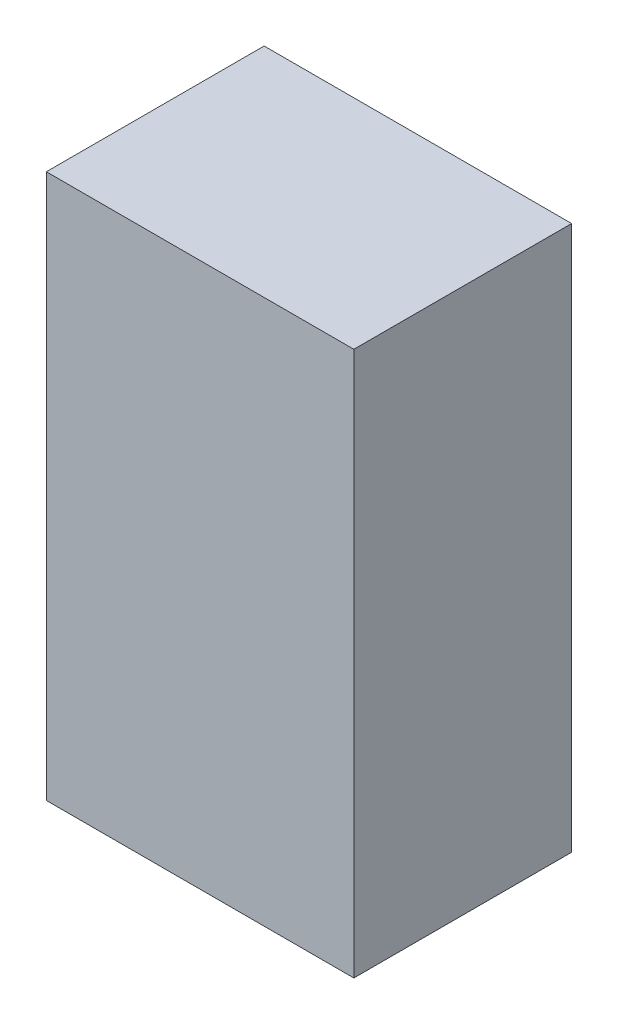
ISO-10303-21;
HEADER;
FILE_DESCRIPTION(('STEP AP214'),'2;1');
FILE_NAME('part.step','',(''),(''),'','','');
FILE_SCHEMA(('AUTOMOTIVE_DESIGN { 1 0 10303 214 1 1 1 1 }'));
ENDSEC;
DATA;
#1=APPLICATION_CONTEXT('core data for automotive mechanical design processes');
#2=APPLICATION_PROTOCOL_DEFINITION('international standard','automotive_design',2000,#1);
#3=PRODUCT_CONTEXT('',#1,'mechanical');
#4=PRODUCT('Part','Part','',(#3));
#5=PRODUCT_RELATED_PRODUCT_CATEGORY('part','',(#4));
#6=PRODUCT_DEFINITION_FORMATION('','',#4);
#7=PRODUCT_DEFINITION_CONTEXT('part definition',#1,'design');
#8=PRODUCT_DEFINITION('design','',#6,#7);
#9=PRODUCT_DEFINITION_SHAPE('','',#8);
#10=(LENGTH_UNIT() NAMED_UNIT(*) SI_UNIT(.MILLI.,.METRE.));
#11=(NAMED_UNIT(*) PLANE_ANGLE_UNIT() SI_UNIT($,.RADIAN.));
#12=(NAMED_UNIT(*) SI_UNIT($,.STERADIAN.) SOLID_ANGLE_UNIT());
#13=UNCERTAINTY_MEASURE_WITH_UNIT(LENGTH_MEASURE(1.E-05),#10,'distance_accuracy_value','');
#14=(GEOMETRIC_REPRESENTATION_CONTEXT(3) GLOBAL_UNCERTAINTY_ASSIGNED_CONTEXT((#13)) GLOBAL_UNIT_ASSIGNED_CONTEXT((#10,
#11,#12)) REPRESENTATION_CONTEXT('',''));
#15=CARTESIAN_POINT('',(0.,0.,0.));
#16=DIRECTION('',(0.,0.,1.));
#17=DIRECTION('',(1.,0.,0.));
#18=AXIS2_PLACEMENT_3D('',#15,#16,#17);
#19=CARTESIAN_POINT('',(0.,0.,34.));
#20=DIRECTION('',(1.,0.,0.));
#21=DIRECTION('',(0.,1.,0.));
#22=AXIS2_PLACEMENT_3D('',#19,#20,#21);
#23=PLANE('',#22);
#24=DIRECTION('',(0.,-1.,0.));
#25=VECTOR('',#24,1.);
#26=CARTESIAN_POINT('',(0.,0.,0.));
#27=LINE('',#26,#25);
#28=CARTESIAN_POINT('',(0.,0.,0.));
#29=VERTEX_POINT('',#28);
#30=CARTESIAN_POINT('',(0.,-85.,0.));
#31=VERTEX_POINT('',#30);
#32=EDGE_CURVE('E100',#29,#31,#27,.T.);
#33=ORIENTED_EDGE('',*,*,#32,.T.);
#34=DIRECTION('',(0.,0.,-1.));
#35=VECTOR('',#34,1.);
#36=CARTESIAN_POINT('',(0.,-85.,34.));
#37=LINE('',#36,#35);
#38=CARTESIAN_POINT('',(0.,-85.,34.));
#39=VERTEX_POINT('',#38);
#40=EDGE_CURVE('E11',#39,#31,#37,.T.);
#41=ORIENTED_EDGE('',*,*,#40,.F.);
#42=DIRECTION('',(0.,-1.,0.));
#43=VECTOR('',#42,1.);
#44=CARTESIAN_POINT('',(0.,0.,34.));
#45=LINE('',#44,#43);
#46=CARTESIAN_POINT('',(0.,0.,34.));
#47=VERTEX_POINT('',#46);
#48=EDGE_CURVE('E88',#47,#39,#45,.T.);
#49=ORIENTED_EDGE('',*,*,#48,.F.);
#50=DIRECTION('',(0.,0.,-1.));
#51=VECTOR('',#50,1.);
#52=CARTESIAN_POINT('',(0.,0.,34.));
#53=LINE('',#52,#51);
#54=EDGE_CURVE('E96',#47,#29,#53,.T.);
#55=ORIENTED_EDGE('',*,*,#54,.T.);
#56=EDGE_LOOP('',(#33,#41,#49,#55));
#57=FACE_BOUND('',#56,.T.);
#58=ADVANCED_FACE('F37',(#57),#23,.F.);
#59=CARTESIAN_POINT('',(0.,-85.,34.));
#60=DIRECTION('',(0.,1.,0.));
#61=DIRECTION('',(0.,0.,1.));
#62=AXIS2_PLACEMENT_3D('',#59,#60,#61);
#63=PLANE('',#62);
#64=DIRECTION('',(1.,0.,0.));
#65=VECTOR('',#64,1.);
#66=CARTESIAN_POINT('',(0.,-85.,0.));
#67=LINE('',#66,#65);
#68=CARTESIAN_POINT('',(48.,-85.,0.));
#69=VERTEX_POINT('',#68);
#70=EDGE_CURVE('E92',#31,#69,#67,.T.);
#71=ORIENTED_EDGE('',*,*,#70,.T.);
#72=DIRECTION('',(0.,0.,-1.));
#73=VECTOR('',#72,1.);
#74=CARTESIAN_POINT('',(48.,-85.,34.));
#75=LINE('',#74,#73);
#76=CARTESIAN_POINT('',(48.,-85.,34.));
#77=VERTEX_POINT('',#76);
#78=EDGE_CURVE('E45',#77,#69,#75,.T.);
#79=ORIENTED_EDGE('',*,*,#78,.F.);
#80=DIRECTION('',(1.,0.,0.));
#81=VECTOR('',#80,1.);
#82=CARTESIAN_POINT('',(0.,-85.,34.));
#83=LINE('',#82,#81);
#84=EDGE_CURVE('E83',#39,#77,#83,.T.);
#85=ORIENTED_EDGE('',*,*,#84,.F.);
#86=ORIENTED_EDGE('',*,*,#40,.T.);
#87=EDGE_LOOP('',(#71,#79,#85,#86));
#88=FACE_BOUND('',#87,.T.);
#89=ADVANCED_FACE('F91',(#88),#63,.F.);
#90=CARTESIAN_POINT('',(48.,0.,34.));
#91=DIRECTION('',(-1.,0.,0.));
#92=DIRECTION('',(0.,-1.,0.));
#93=AXIS2_PLACEMENT_3D('',#90,#91,#92);
#94=PLANE('',#93);
#95=DIRECTION('',(0.,1.,0.));
#96=VECTOR('',#95,1.);
#97=CARTESIAN_POINT('',(48.,0.,0.));
#98=LINE('',#97,#96);
#99=CARTESIAN_POINT('',(48.,0.,0.));
#100=VERTEX_POINT('',#99);
#101=EDGE_CURVE('E70',#69,#100,#98,.T.);
#102=ORIENTED_EDGE('',*,*,#101,.T.);
#103=DIRECTION('',(0.,0.,-1.));
#104=VECTOR('',#103,1.);
#105=CARTESIAN_POINT('',(48.,0.,34.));
#106=LINE('',#105,#104);
#107=CARTESIAN_POINT('',(48.,0.,34.));
#108=VERTEX_POINT('',#107);
#109=EDGE_CURVE('E93',#108,#100,#106,.T.);
#110=ORIENTED_EDGE('',*,*,#109,.F.);
#111=DIRECTION('',(0.,1.,0.));
#112=VECTOR('',#111,1.);
#113=CARTESIAN_POINT('',(48.,0.,34.));
#114=LINE('',#113,#112);
#115=EDGE_CURVE('E86',#77,#108,#114,.T.);
#116=ORIENTED_EDGE('',*,*,#115,.F.);
#117=ORIENTED_EDGE('',*,*,#78,.T.);
#118=EDGE_LOOP('',(#102,#110,#116,#117));
#119=FACE_BOUND('',#118,.T.);
#120=ADVANCED_FACE('F94',(#119),#94,.F.);
#121=CARTESIAN_POINT('',(0.,0.,34.));
#122=DIRECTION('',(0.,-1.,0.));
#123=DIRECTION('',(0.,0.,-1.));
#124=AXIS2_PLACEMENT_3D('',#121,#122,#123);
#125=PLANE('',#124);
#126=DIRECTION('',(-1.,0.,0.));
#127=VECTOR('',#126,1.);
#128=CARTESIAN_POINT('',(0.,0.,0.));
#129=LINE('',#128,#127);
#130=EDGE_CURVE('E76',#100,#29,#129,.T.);
#131=ORIENTED_EDGE('',*,*,#130,.T.);
#132=ORIENTED_EDGE('',*,*,#54,.F.);
#133=DIRECTION('',(-1.,0.,0.));
#134=VECTOR('',#133,1.);
#135=CARTESIAN_POINT('',(0.,0.,34.));
#136=LINE('',#135,#134);
#137=EDGE_CURVE('E53',#108,#47,#136,.T.);
#138=ORIENTED_EDGE('',*,*,#137,.F.);
#139=ORIENTED_EDGE('',*,*,#109,.T.);
#140=EDGE_LOOP('',(#131,#132,#138,#139));
#141=FACE_BOUND('',#140,.T.);
#142=ADVANCED_FACE('F107',(#141),#125,.F.);
#143=CARTESIAN_POINT('',(0.,0.,34.));
#144=DIRECTION('',(0.,0.,1.));
#145=DIRECTION('',(1.,0.,0.));
#146=AXIS2_PLACEMENT_3D('',#143,#144,#145);
#147=PLANE('',#146);
#148=ORIENTED_EDGE('',*,*,#48,.T.);
#149=ORIENTED_EDGE('',*,*,#84,.T.);
#150=ORIENTED_EDGE('',*,*,#115,.T.);
#151=ORIENTED_EDGE('',*,*,#137,.T.);
#152=EDGE_LOOP('',(#148,#149,#150,#151));
#153=FACE_BOUND('',#152,.T.);
#154=ADVANCED_FACE('F84',(#153),#147,.T.);
#155=CARTESIAN_POINT('',(0.,0.,0.));
#156=DIRECTION('',(0.,0.,1.));
#157=DIRECTION('',(1.,0.,0.));
#158=AXIS2_PLACEMENT_3D('',#155,#156,#157);
#159=PLANE('',#158);
#160=ORIENTED_EDGE('',*,*,#32,.F.);
#161=ORIENTED_EDGE('',*,*,#130,.F.);
#162=ORIENTED_EDGE('',*,*,#101,.F.);
#163=ORIENTED_EDGE('',*,*,#70,.F.);
#164=EDGE_LOOP('',(#160,#161,#162,#163));
#165=FACE_BOUND('',#164,.T.);
#166=ADVANCED_FACE('F110',(#165),#159,.F.);
#167=CLOSED_SHELL('',(#58,#89,#120,#142,#154,#166));
#168=MANIFOLD_SOLID_BREP('B2',#167);
#169=ADVANCED_BREP_SHAPE_REPRESENTATION('',(#18,#168),#14);
#170=SHAPE_DEFINITION_REPRESENTATION(#9,#169);
ENDSEC;
END-ISO-10303-21;
